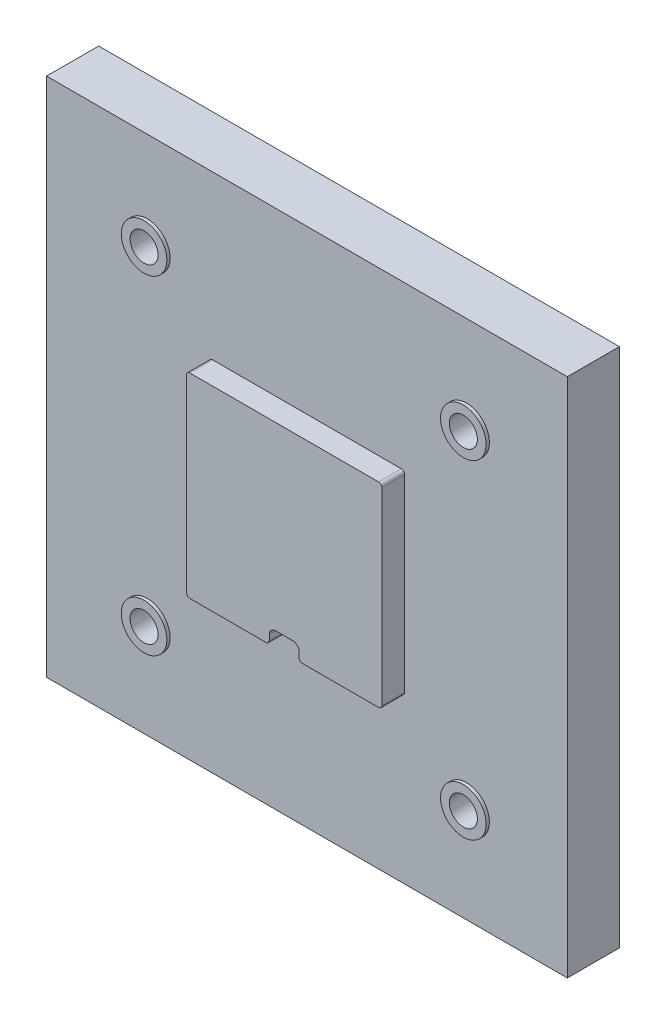
ISO-10303-21;
HEADER;
FILE_DESCRIPTION(('STEP AP214'),'2;1');
FILE_NAME('part.step','',(''),(''),'','','');
FILE_SCHEMA(('AUTOMOTIVE_DESIGN { 1 0 10303 214 1 1 1 1 }'));
ENDSEC;
DATA;
#1=APPLICATION_CONTEXT('core data for automotive mechanical design processes');
#2=APPLICATION_PROTOCOL_DEFINITION('international standard','automotive_design',2000,#1);
#3=PRODUCT_CONTEXT('',#1,'mechanical');
#4=PRODUCT('Part','Part','',(#3));
#5=PRODUCT_RELATED_PRODUCT_CATEGORY('part','',(#4));
#6=PRODUCT_DEFINITION_FORMATION('','',#4);
#7=PRODUCT_DEFINITION_CONTEXT('part definition',#1,'design');
#8=PRODUCT_DEFINITION('design','',#6,#7);
#9=PRODUCT_DEFINITION_SHAPE('','',#8);
#10=(LENGTH_UNIT() NAMED_UNIT(*) SI_UNIT(.MILLI.,.METRE.));
#11=(NAMED_UNIT(*) PLANE_ANGLE_UNIT() SI_UNIT($,.RADIAN.));
#12=(NAMED_UNIT(*) SI_UNIT($,.STERADIAN.) SOLID_ANGLE_UNIT());
#13=UNCERTAINTY_MEASURE_WITH_UNIT(LENGTH_MEASURE(1.E-05),#10,'distance_accuracy_value','');
#14=(GEOMETRIC_REPRESENTATION_CONTEXT(3) GLOBAL_UNCERTAINTY_ASSIGNED_CONTEXT((#13)) GLOBAL_UNIT_ASSIGNED_CONTEXT((#10,
#11,#12)) REPRESENTATION_CONTEXT('',''));
#15=CARTESIAN_POINT('',(0.,0.,0.));
#16=DIRECTION('',(0.,0.,1.));
#17=DIRECTION('',(1.,0.,0.));
#18=AXIS2_PLACEMENT_3D('',#15,#16,#17);
#19=CARTESIAN_POINT('',(15.,-15.,3.5));
#20=DIRECTION('',(0.,1.,0.));
#21=DIRECTION('',(-1.,0.,0.));
#22=AXIS2_PLACEMENT_3D('',#19,#20,#21);
#23=PLANE('',#22);
#24=DIRECTION('',(1.,0.,0.));
#25=VECTOR('',#24,1.);
#26=CARTESIAN_POINT('',(15.,-15.,0.));
#27=LINE('',#26,#25);
#28=CARTESIAN_POINT('',(2.79289321881345,-15.,0.));
#29=VERTEX_POINT('',#28);
#30=CARTESIAN_POINT('',(14.5,-15.,0.));
#31=VERTEX_POINT('',#30);
#32=EDGE_CURVE('E272',#29,#31,#27,.T.);
#33=ORIENTED_EDGE('',*,*,#32,.T.);
#34=DIRECTION('',(0.,0.,-1.));
#35=VECTOR('',#34,1.);
#36=CARTESIAN_POINT('',(14.5,-15.,3.5));
#37=LINE('',#36,#35);
#38=CARTESIAN_POINT('',(14.5,-15.,3.5));
#39=VERTEX_POINT('',#38);
#40=EDGE_CURVE('E314',#31,#39,#37,.F.);
#41=ORIENTED_EDGE('',*,*,#40,.T.);
#42=DIRECTION('',(1.,0.,0.));
#43=VECTOR('',#42,1.);
#44=CARTESIAN_POINT('',(15.,-15.,3.5));
#45=LINE('',#44,#43);
#46=CARTESIAN_POINT('',(2.79289321881345,-15.,3.5));
#47=VERTEX_POINT('',#46);
#48=EDGE_CURVE('E260',#47,#39,#45,.T.);
#49=ORIENTED_EDGE('',*,*,#48,.F.);
#50=DIRECTION('',(0.,0.,1.));
#51=VECTOR('',#50,1.);
#52=CARTESIAN_POINT('',(2.79289321881345,-15.,3.5));
#53=LINE('',#52,#51);
#54=EDGE_CURVE('E312',#47,#29,#53,.F.);
#55=ORIENTED_EDGE('',*,*,#54,.T.);
#56=EDGE_LOOP('',(#33,#41,#49,#55));
#57=FACE_BOUND('',#56,.T.);
#58=ADVANCED_FACE('F39',(#57),#23,.F.);
#59=CARTESIAN_POINT('',(-15.,-15.,3.5));
#60=DIRECTION('',(1.,0.,0.));
#61=DIRECTION('',(0.,1.,0.));
#62=AXIS2_PLACEMENT_3D('',#59,#60,#61);
#63=PLANE('',#62);
#64=DIRECTION('',(0.,-1.,0.));
#65=VECTOR('',#64,1.);
#66=CARTESIAN_POINT('',(-15.,-15.,3.5));
#67=LINE('',#66,#65);
#68=CARTESIAN_POINT('',(-15.,14.5,3.5));
#69=VERTEX_POINT('',#68);
#70=CARTESIAN_POINT('',(-15.,-14.5,3.5));
#71=VERTEX_POINT('',#70);
#72=EDGE_CURVE('E257',#69,#71,#67,.T.);
#73=ORIENTED_EDGE('',*,*,#72,.F.);
#74=DIRECTION('',(0.,0.,-1.));
#75=VECTOR('',#74,1.);
#76=CARTESIAN_POINT('',(-15.,14.5,3.5));
#77=LINE('',#76,#75);
#78=CARTESIAN_POINT('',(-15.,14.5,0.));
#79=VERTEX_POINT('',#78);
#80=EDGE_CURVE('E282',#69,#79,#77,.T.);
#81=ORIENTED_EDGE('',*,*,#80,.T.);
#82=DIRECTION('',(0.,-1.,0.));
#83=VECTOR('',#82,1.);
#84=CARTESIAN_POINT('',(-15.,-15.,0.));
#85=LINE('',#84,#83);
#86=CARTESIAN_POINT('',(-15.,-14.5,0.));
#87=VERTEX_POINT('',#86);
#88=EDGE_CURVE('E256',#79,#87,#85,.T.);
#89=ORIENTED_EDGE('',*,*,#88,.T.);
#90=DIRECTION('',(0.,0.,-1.));
#91=VECTOR('',#90,1.);
#92=CARTESIAN_POINT('',(-15.,-14.5,3.5));
#93=LINE('',#92,#91);
#94=EDGE_CURVE('E269',#87,#71,#93,.F.);
#95=ORIENTED_EDGE('',*,*,#94,.T.);
#96=EDGE_LOOP('',(#73,#81,#89,#95));
#97=FACE_BOUND('',#96,.T.);
#98=ADVANCED_FACE('F383',(#97),#63,.F.);
#99=CARTESIAN_POINT('',(-14.5,-15.,3.5));
#100=VERTEX_POINT('',#99);
#101=CARTESIAN_POINT('',(-2.79289321881346,-15.,3.5));
#102=VERTEX_POINT('',#101);
#103=EDGE_CURVE('E262',#100,#102,#45,.T.);
#104=ORIENTED_EDGE('',*,*,#103,.F.);
#105=DIRECTION('',(0.,0.,-1.));
#106=VECTOR('',#105,1.);
#107=CARTESIAN_POINT('',(-14.5,-15.,3.5));
#108=LINE('',#107,#106);
#109=CARTESIAN_POINT('',(-14.5,-15.,0.));
#110=VERTEX_POINT('',#109);
#111=EDGE_CURVE('E304',#100,#110,#108,.T.);
#112=ORIENTED_EDGE('',*,*,#111,.T.);
#113=CARTESIAN_POINT('',(-2.79289321881346,-15.,0.));
#114=VERTEX_POINT('',#113);
#115=EDGE_CURVE('E275',#110,#114,#27,.T.);
#116=ORIENTED_EDGE('',*,*,#115,.T.);
#117=DIRECTION('',(0.,0.,1.));
#118=VECTOR('',#117,1.);
#119=CARTESIAN_POINT('',(-2.79289321881346,-15.,3.5));
#120=LINE('',#119,#118);
#121=EDGE_CURVE('E301',#114,#102,#120,.T.);
#122=ORIENTED_EDGE('',*,*,#121,.T.);
#123=EDGE_LOOP('',(#104,#112,#116,#122));
#124=FACE_BOUND('',#123,.T.);
#125=ADVANCED_FACE('F386',(#124),#23,.F.);
#126=CARTESIAN_POINT('',(15.,15.,3.5));
#127=DIRECTION('',(-1.,0.,0.));
#128=DIRECTION('',(0.,-1.,0.));
#129=AXIS2_PLACEMENT_3D('',#126,#127,#128);
#130=PLANE('',#129);
#131=DIRECTION('',(0.,1.,0.));
#132=VECTOR('',#131,1.);
#133=CARTESIAN_POINT('',(15.,15.,0.));
#134=LINE('',#133,#132);
#135=CARTESIAN_POINT('',(15.,-14.5,0.));
#136=VERTEX_POINT('',#135);
#137=CARTESIAN_POINT('',(15.,14.5,0.));
#138=VERTEX_POINT('',#137);
#139=EDGE_CURVE('E276',#136,#138,#134,.T.);
#140=ORIENTED_EDGE('',*,*,#139,.T.);
#141=DIRECTION('',(0.,0.,-1.));
#142=VECTOR('',#141,1.);
#143=CARTESIAN_POINT('',(15.,14.5,3.5));
#144=LINE('',#143,#142);
#145=CARTESIAN_POINT('',(15.,14.5,3.5));
#146=VERTEX_POINT('',#145);
#147=EDGE_CURVE('E310',#138,#146,#144,.F.);
#148=ORIENTED_EDGE('',*,*,#147,.T.);
#149=DIRECTION('',(0.,1.,0.));
#150=VECTOR('',#149,1.);
#151=CARTESIAN_POINT('',(15.,15.,3.5));
#152=LINE('',#151,#150);
#153=CARTESIAN_POINT('',(15.,-14.5,3.5));
#154=VERTEX_POINT('',#153);
#155=EDGE_CURVE('E264',#154,#146,#152,.T.);
#156=ORIENTED_EDGE('',*,*,#155,.F.);
#157=DIRECTION('',(0.,0.,-1.));
#158=VECTOR('',#157,1.);
#159=CARTESIAN_POINT('',(15.,-14.5,3.5));
#160=LINE('',#159,#158);
#161=EDGE_CURVE('E307',#154,#136,#160,.T.);
#162=ORIENTED_EDGE('',*,*,#161,.T.);
#163=EDGE_LOOP('',(#140,#148,#156,#162));
#164=FACE_BOUND('',#163,.T.);
#165=ADVANCED_FACE('F394',(#164),#130,.F.);
#166=CARTESIAN_POINT('',(-15.,15.,3.5));
#167=DIRECTION('',(0.,-1.,0.));
#168=DIRECTION('',(1.,0.,0.));
#169=AXIS2_PLACEMENT_3D('',#166,#167,#168);
#170=PLANE('',#169);
#171=DIRECTION('',(-1.,0.,0.));
#172=VECTOR('',#171,1.);
#173=CARTESIAN_POINT('',(-15.,15.,0.));
#174=LINE('',#173,#172);
#175=CARTESIAN_POINT('',(14.5,15.,0.));
#176=VERTEX_POINT('',#175);
#177=CARTESIAN_POINT('',(-14.5,15.,0.));
#178=VERTEX_POINT('',#177);
#179=EDGE_CURVE('E261',#176,#178,#174,.T.);
#180=ORIENTED_EDGE('',*,*,#179,.T.);
#181=DIRECTION('',(0.,0.,-1.));
#182=VECTOR('',#181,1.);
#183=CARTESIAN_POINT('',(-14.5,15.,3.5));
#184=LINE('',#183,#182);
#185=CARTESIAN_POINT('',(-14.5,15.,3.5));
#186=VERTEX_POINT('',#185);
#187=EDGE_CURVE('E288',#178,#186,#184,.F.);
#188=ORIENTED_EDGE('',*,*,#187,.T.);
#189=DIRECTION('',(-1.,0.,0.));
#190=VECTOR('',#189,1.);
#191=CARTESIAN_POINT('',(-15.,15.,3.5));
#192=LINE('',#191,#190);
#193=CARTESIAN_POINT('',(14.5,15.,3.5));
#194=VERTEX_POINT('',#193);
#195=EDGE_CURVE('E267',#194,#186,#192,.T.);
#196=ORIENTED_EDGE('',*,*,#195,.F.);
#197=DIRECTION('',(0.,0.,-1.));
#198=VECTOR('',#197,1.);
#199=CARTESIAN_POINT('',(14.5,15.,3.5));
#200=LINE('',#199,#198);
#201=EDGE_CURVE('E285',#194,#176,#200,.T.);
#202=ORIENTED_EDGE('',*,*,#201,.T.);
#203=EDGE_LOOP('',(#180,#188,#196,#202));
#204=FACE_BOUND('',#203,.T.);
#205=ADVANCED_FACE('F399',(#204),#170,.F.);
#206=CARTESIAN_POINT('',(0.,0.,3.5));
#207=DIRECTION('',(0.,0.,-1.));
#208=DIRECTION('',(-1.,0.,0.));
#209=AXIS2_PLACEMENT_3D('',#206,#207,#208);
#210=PLANE('',#209);
#211=ORIENTED_EDGE('',*,*,#195,.T.);
#212=CARTESIAN_POINT('',(-14.5,14.5,3.5));
#213=DIRECTION('',(0.,0.,-1.));
#214=DIRECTION('',(-1.,0.,0.));
#215=AXIS2_PLACEMENT_3D('',#212,#213,#214);
#216=CIRCLE('',#215,0.5);
#217=EDGE_CURVE('E299',#186,#69,#216,.F.);
#218=ORIENTED_EDGE('',*,*,#217,.T.);
#219=ORIENTED_EDGE('',*,*,#72,.T.);
#220=CARTESIAN_POINT('',(-14.5,-14.5,3.5));
#221=DIRECTION('',(0.,0.,-1.));
#222=DIRECTION('',(-1.,0.,0.));
#223=AXIS2_PLACEMENT_3D('',#220,#221,#222);
#224=CIRCLE('',#223,0.5);
#225=EDGE_CURVE('E297',#71,#100,#224,.F.);
#226=ORIENTED_EDGE('',*,*,#225,.T.);
#227=ORIENTED_EDGE('',*,*,#103,.T.);
#228=CARTESIAN_POINT('',(-2.79289321881346,-14.5,3.5));
#229=DIRECTION('',(0.,0.,-1.));
#230=DIRECTION('',(-1.,0.,0.));
#231=AXIS2_PLACEMENT_3D('',#228,#229,#230);
#232=CIRCLE('',#231,0.5);
#233=CARTESIAN_POINT('',(-2.29289321881346,-14.5,3.5));
#234=VERTEX_POINT('',#233);
#235=EDGE_CURVE('E200',#102,#234,#232,.F.);
#236=ORIENTED_EDGE('',*,*,#235,.T.);
#237=DIRECTION('',(0.,-1.,0.));
#238=VECTOR('',#237,1.);
#239=CARTESIAN_POINT('',(-2.29289321881346,-13.7071067811865,3.5));
#240=LINE('',#239,#238);
#241=CARTESIAN_POINT('',(-2.29289321881346,-13.7071067811865,3.5));
#242=VERTEX_POINT('',#241);
#243=EDGE_CURVE('E180',#242,#234,#240,.T.);
#244=ORIENTED_EDGE('',*,*,#243,.F.);
#245=CARTESIAN_POINT('',(-1.29289321881346,-13.7071067811865,3.5));
#246=DIRECTION('',(0.,0.,1.));
#247=DIRECTION('',(1.,0.,0.));
#248=AXIS2_PLACEMENT_3D('',#245,#246,#247);
#249=CIRCLE('',#248,1.);
#250=CARTESIAN_POINT('',(-1.29289321881346,-12.7071067811865,3.5));
#251=VERTEX_POINT('',#250);
#252=EDGE_CURVE('E187',#251,#242,#249,.T.);
#253=ORIENTED_EDGE('',*,*,#252,.F.);
#254=DIRECTION('',(-1.,0.,0.));
#255=VECTOR('',#254,1.);
#256=CARTESIAN_POINT('',(1.29289321881345,-12.7071067811865,3.5));
#257=LINE('',#256,#255);
#258=CARTESIAN_POINT('',(1.29289321881345,-12.7071067811865,3.5));
#259=VERTEX_POINT('',#258);
#260=EDGE_CURVE('E195',#259,#251,#257,.T.);
#261=ORIENTED_EDGE('',*,*,#260,.F.);
#262=CARTESIAN_POINT('',(1.29289321881345,-13.7071067811865,3.5));
#263=DIRECTION('',(0.,0.,1.));
#264=DIRECTION('',(1.,0.,0.));
#265=AXIS2_PLACEMENT_3D('',#262,#263,#264);
#266=CIRCLE('',#265,1.);
#267=CARTESIAN_POINT('',(2.29289321881345,-13.7071067811865,3.5));
#268=VERTEX_POINT('',#267);
#269=EDGE_CURVE('E204',#268,#259,#266,.T.);
#270=ORIENTED_EDGE('',*,*,#269,.F.);
#271=DIRECTION('',(0.,1.,0.));
#272=VECTOR('',#271,1.);
#273=CARTESIAN_POINT('',(2.29289321881345,-15.,3.5));
#274=LINE('',#273,#272);
#275=CARTESIAN_POINT('',(2.29289321881345,-14.5,3.5));
#276=VERTEX_POINT('',#275);
#277=EDGE_CURVE('E201',#276,#268,#274,.T.);
#278=ORIENTED_EDGE('',*,*,#277,.F.);
#279=CARTESIAN_POINT('',(2.79289321881345,-14.5,3.5));
#280=DIRECTION('',(0.,0.,-1.));
#281=DIRECTION('',(-1.,0.,0.));
#282=AXIS2_PLACEMENT_3D('',#279,#280,#281);
#283=CIRCLE('',#282,0.5);
#284=EDGE_CURVE('E291',#276,#47,#283,.F.);
#285=ORIENTED_EDGE('',*,*,#284,.T.);
#286=ORIENTED_EDGE('',*,*,#48,.T.);
#287=CARTESIAN_POINT('',(14.5,-14.5,3.5));
#288=DIRECTION('',(0.,0.,-1.));
#289=DIRECTION('',(-1.,0.,0.));
#290=AXIS2_PLACEMENT_3D('',#287,#288,#289);
#291=CIRCLE('',#290,0.5);
#292=EDGE_CURVE('E293',#39,#154,#291,.F.);
#293=ORIENTED_EDGE('',*,*,#292,.T.);
#294=ORIENTED_EDGE('',*,*,#155,.T.);
#295=CARTESIAN_POINT('',(14.5,14.5,3.5));
#296=DIRECTION('',(0.,0.,-1.));
#297=DIRECTION('',(-1.,0.,0.));
#298=AXIS2_PLACEMENT_3D('',#295,#296,#297);
#299=CIRCLE('',#298,0.5);
#300=EDGE_CURVE('E295',#146,#194,#299,.F.);
#301=ORIENTED_EDGE('',*,*,#300,.T.);
#302=EDGE_LOOP('',(#211,#218,#219,#226,#227,#236,#244,#253,#261,#270,#278,#285,#286,#293,#294,#301));
#303=FACE_BOUND('',#302,.T.);
#304=ADVANCED_FACE('F198',(#303),#210,.F.);
#305=CARTESIAN_POINT('',(-40.,-40.,-8.));
#306=DIRECTION('',(1.,0.,0.));
#307=DIRECTION('',(0.,1.,0.));
#308=AXIS2_PLACEMENT_3D('',#305,#306,#307);
#309=PLANE('',#308);
#310=DIRECTION('',(0.,1.,0.));
#311=VECTOR('',#310,1.);
#312=CARTESIAN_POINT('',(-40.,-40.,0.));
#313=LINE('',#312,#311);
#314=CARTESIAN_POINT('',(-40.,-40.,0.));
#315=VERTEX_POINT('',#314);
#316=CARTESIAN_POINT('',(-40.,40.,0.));
#317=VERTEX_POINT('',#316);
#318=EDGE_CURVE('E212',#315,#317,#313,.T.);
#319=ORIENTED_EDGE('',*,*,#318,.T.);
#320=DIRECTION('',(0.,0.,1.));
#321=VECTOR('',#320,1.);
#322=CARTESIAN_POINT('',(-40.,40.,-8.));
#323=LINE('',#322,#321);
#324=CARTESIAN_POINT('',(-40.,40.,-8.));
#325=VERTEX_POINT('',#324);
#326=EDGE_CURVE('E253',#325,#317,#323,.T.);
#327=ORIENTED_EDGE('',*,*,#326,.F.);
#328=DIRECTION('',(0.,1.,0.));
#329=VECTOR('',#328,1.);
#330=CARTESIAN_POINT('',(-40.,-40.,-8.));
#331=LINE('',#330,#329);
#332=CARTESIAN_POINT('',(-40.,-40.,-8.));
#333=VERTEX_POINT('',#332);
#334=EDGE_CURVE('E227',#333,#325,#331,.T.);
#335=ORIENTED_EDGE('',*,*,#334,.F.);
#336=DIRECTION('',(0.,0.,1.));
#337=VECTOR('',#336,1.);
#338=CARTESIAN_POINT('',(-40.,-40.,-8.));
#339=LINE('',#338,#337);
#340=EDGE_CURVE('E237',#333,#315,#339,.T.);
#341=ORIENTED_EDGE('',*,*,#340,.T.);
#342=EDGE_LOOP('',(#319,#327,#335,#341));
#343=FACE_BOUND('',#342,.T.);
#344=ADVANCED_FACE('F358',(#343),#309,.F.);
#345=CARTESIAN_POINT('',(-40.,40.,-8.));
#346=DIRECTION('',(0.,-1.,0.));
#347=DIRECTION('',(0.,0.,-1.));
#348=AXIS2_PLACEMENT_3D('',#345,#346,#347);
#349=PLANE('',#348);
#350=DIRECTION('',(1.,0.,0.));
#351=VECTOR('',#350,1.);
#352=CARTESIAN_POINT('',(-40.,40.,0.));
#353=LINE('',#352,#351);
#354=CARTESIAN_POINT('',(40.,40.,0.));
#355=VERTEX_POINT('',#354);
#356=EDGE_CURVE('E240',#317,#355,#353,.T.);
#357=ORIENTED_EDGE('',*,*,#356,.T.);
#358=DIRECTION('',(0.,0.,1.));
#359=VECTOR('',#358,1.);
#360=CARTESIAN_POINT('',(40.,40.,-8.));
#361=LINE('',#360,#359);
#362=CARTESIAN_POINT('',(40.,40.,-8.));
#363=VERTEX_POINT('',#362);
#364=EDGE_CURVE('E250',#363,#355,#361,.T.);
#365=ORIENTED_EDGE('',*,*,#364,.F.);
#366=DIRECTION('',(1.,0.,0.));
#367=VECTOR('',#366,1.);
#368=CARTESIAN_POINT('',(-40.,40.,-8.));
#369=LINE('',#368,#367);
#370=EDGE_CURVE('E230',#325,#363,#369,.T.);
#371=ORIENTED_EDGE('',*,*,#370,.F.);
#372=ORIENTED_EDGE('',*,*,#326,.T.);
#373=EDGE_LOOP('',(#357,#365,#371,#372));
#374=FACE_BOUND('',#373,.T.);
#375=ADVANCED_FACE('F370',(#374),#349,.F.);
#376=CARTESIAN_POINT('',(40.,40.,-8.));
#377=DIRECTION('',(-1.,0.,0.));
#378=DIRECTION('',(0.,-1.,0.));
#379=AXIS2_PLACEMENT_3D('',#376,#377,#378);
#380=PLANE('',#379);
#381=DIRECTION('',(0.,-1.,0.));
#382=VECTOR('',#381,1.);
#383=CARTESIAN_POINT('',(40.,40.,0.));
#384=LINE('',#383,#382);
#385=CARTESIAN_POINT('',(40.,-40.,0.));
#386=VERTEX_POINT('',#385);
#387=EDGE_CURVE('E242',#355,#386,#384,.T.);
#388=ORIENTED_EDGE('',*,*,#387,.T.);
#389=DIRECTION('',(0.,0.,1.));
#390=VECTOR('',#389,1.);
#391=CARTESIAN_POINT('',(40.,-40.,-8.));
#392=LINE('',#391,#390);
#393=CARTESIAN_POINT('',(40.,-40.,-8.));
#394=VERTEX_POINT('',#393);
#395=EDGE_CURVE('E247',#394,#386,#392,.T.);
#396=ORIENTED_EDGE('',*,*,#395,.F.);
#397=DIRECTION('',(0.,-1.,0.));
#398=VECTOR('',#397,1.);
#399=CARTESIAN_POINT('',(40.,40.,-8.));
#400=LINE('',#399,#398);
#401=EDGE_CURVE('E233',#363,#394,#400,.T.);
#402=ORIENTED_EDGE('',*,*,#401,.F.);
#403=ORIENTED_EDGE('',*,*,#364,.T.);
#404=EDGE_LOOP('',(#388,#396,#402,#403));
#405=FACE_BOUND('',#404,.T.);
#406=ADVANCED_FACE('F367',(#405),#380,.F.);
#407=CARTESIAN_POINT('',(40.,-40.,-8.));
#408=DIRECTION('',(0.,1.,0.));
#409=DIRECTION('',(0.,0.,1.));
#410=AXIS2_PLACEMENT_3D('',#407,#408,#409);
#411=PLANE('',#410);
#412=DIRECTION('',(-1.,0.,0.));
#413=VECTOR('',#412,1.);
#414=CARTESIAN_POINT('',(40.,-40.,0.));
#415=LINE('',#414,#413);
#416=EDGE_CURVE('E231',#386,#315,#415,.T.);
#417=ORIENTED_EDGE('',*,*,#416,.T.);
#418=ORIENTED_EDGE('',*,*,#340,.F.);
#419=DIRECTION('',(-1.,0.,0.));
#420=VECTOR('',#419,1.);
#421=CARTESIAN_POINT('',(40.,-40.,-8.));
#422=LINE('',#421,#420);
#423=EDGE_CURVE('E235',#394,#333,#422,.T.);
#424=ORIENTED_EDGE('',*,*,#423,.F.);
#425=ORIENTED_EDGE('',*,*,#395,.T.);
#426=EDGE_LOOP('',(#417,#418,#424,#425));
#427=FACE_BOUND('',#426,.T.);
#428=ADVANCED_FACE('F363',(#427),#411,.F.);
#429=CARTESIAN_POINT('',(0.,0.,-8.));
#430=DIRECTION('',(0.,0.,-1.));
#431=DIRECTION('',(-1.,0.,0.));
#432=AXIS2_PLACEMENT_3D('',#429,#430,#431);
#433=PLANE('',#432);
#434=CARTESIAN_POINT('',(-24.525,-25.25,-8.));
#435=DIRECTION('',(0.,0.,-1.));
#436=DIRECTION('',(-1.,0.,0.));
#437=AXIS2_PLACEMENT_3D('',#434,#435,#436);
#438=CIRCLE('',#437,3.5725);
#439=CARTESIAN_POINT('',(-28.0975,-25.25,-8.));
#440=VERTEX_POINT('',#439);
#441=EDGE_CURVE('E475',#440,#440,#438,.T.);
#442=ORIENTED_EDGE('',*,*,#441,.F.);
#443=EDGE_LOOP('',(#442));
#444=FACE_BOUND('',#443,.T.);
#445=CARTESIAN_POINT('',(-24.525,25.25,-8.));
#446=DIRECTION('',(0.,0.,-1.));
#447=DIRECTION('',(-1.,0.,0.));
#448=AXIS2_PLACEMENT_3D('',#445,#446,#447);
#449=CIRCLE('',#448,3.5725);
#450=CARTESIAN_POINT('',(-28.0975,25.25,-8.));
#451=VERTEX_POINT('',#450);
#452=EDGE_CURVE('E466',#451,#451,#449,.T.);
#453=ORIENTED_EDGE('',*,*,#452,.F.);
#454=EDGE_LOOP('',(#453));
#455=FACE_BOUND('',#454,.T.);
#456=CARTESIAN_POINT('',(24.525,25.25,-8.));
#457=DIRECTION('',(0.,0.,-1.));
#458=DIRECTION('',(-1.,0.,0.));
#459=AXIS2_PLACEMENT_3D('',#456,#457,#458);
#460=CIRCLE('',#459,3.5725);
#461=CARTESIAN_POINT('',(20.9525,25.25,-8.));
#462=VERTEX_POINT('',#461);
#463=EDGE_CURVE('E457',#462,#462,#460,.T.);
#464=ORIENTED_EDGE('',*,*,#463,.F.);
#465=EDGE_LOOP('',(#464));
#466=FACE_BOUND('',#465,.T.);
#467=CARTESIAN_POINT('',(24.525,-25.25,-8.));
#468=DIRECTION('',(0.,0.,-1.));
#469=DIRECTION('',(-1.,0.,0.));
#470=AXIS2_PLACEMENT_3D('',#467,#468,#469);
#471=CIRCLE('',#470,3.5725);
#472=CARTESIAN_POINT('',(20.9525,-25.25,-8.));
#473=VERTEX_POINT('',#472);
#474=EDGE_CURVE('E448',#473,#473,#471,.T.);
#475=ORIENTED_EDGE('',*,*,#474,.F.);
#476=EDGE_LOOP('',(#475));
#477=FACE_BOUND('',#476,.T.);
#478=ORIENTED_EDGE('',*,*,#334,.T.);
#479=ORIENTED_EDGE('',*,*,#370,.T.);
#480=ORIENTED_EDGE('',*,*,#401,.T.);
#481=ORIENTED_EDGE('',*,*,#423,.T.);
#482=EDGE_LOOP('',(#478,#479,#480,#481));
#483=FACE_BOUND('',#482,.T.);
#484=ADVANCED_FACE('F345',(#444,#455,#466,#477,#483),#433,.T.);
#485=CARTESIAN_POINT('',(0.,0.,0.));
#486=DIRECTION('',(0.,0.,-1.));
#487=DIRECTION('',(-1.,0.,0.));
#488=AXIS2_PLACEMENT_3D('',#485,#486,#487);
#489=PLANE('',#488);
#490=CARTESIAN_POINT('',(24.525,-25.25,0.));
#491=DIRECTION('',(0.,0.,-1.));
#492=DIRECTION('',(-1.,0.,0.));
#493=AXIS2_PLACEMENT_3D('',#490,#491,#492);
#494=CIRCLE('',#493,3.5);
#495=CARTESIAN_POINT('',(21.025,-25.25,0.));
#496=VERTEX_POINT('',#495);
#497=EDGE_CURVE('E11',#496,#496,#494,.F.);
#498=ORIENTED_EDGE('',*,*,#497,.F.);
#499=EDGE_LOOP('',(#498));
#500=FACE_BOUND('',#499,.T.);
#501=CARTESIAN_POINT('',(-24.525,-25.25,0.));
#502=DIRECTION('',(0.,0.,-1.));
#503=DIRECTION('',(-1.,0.,0.));
#504=AXIS2_PLACEMENT_3D('',#501,#502,#503);
#505=CIRCLE('',#504,3.5);
#506=CARTESIAN_POINT('',(-28.025,-25.25,0.));
#507=VERTEX_POINT('',#506);
#508=EDGE_CURVE('E47',#507,#507,#505,.F.);
#509=ORIENTED_EDGE('',*,*,#508,.F.);
#510=EDGE_LOOP('',(#509));
#511=FACE_BOUND('',#510,.T.);
#512=CARTESIAN_POINT('',(24.525,25.25,0.));
#513=DIRECTION('',(0.,0.,-1.));
#514=DIRECTION('',(-1.,0.,0.));
#515=AXIS2_PLACEMENT_3D('',#512,#513,#514);
#516=CIRCLE('',#515,3.5);
#517=CARTESIAN_POINT('',(21.025,25.25,0.));
#518=VERTEX_POINT('',#517);
#519=EDGE_CURVE('E334',#518,#518,#516,.F.);
#520=ORIENTED_EDGE('',*,*,#519,.F.);
#521=EDGE_LOOP('',(#520));
#522=FACE_BOUND('',#521,.T.);
#523=CARTESIAN_POINT('',(-24.525,25.25,0.));
#524=DIRECTION('',(0.,0.,-1.));
#525=DIRECTION('',(-1.,0.,0.));
#526=AXIS2_PLACEMENT_3D('',#523,#524,#525);
#527=CIRCLE('',#526,3.5);
#528=CARTESIAN_POINT('',(-28.025,25.25,0.));
#529=VERTEX_POINT('',#528);
#530=EDGE_CURVE('E331',#529,#529,#527,.F.);
#531=ORIENTED_EDGE('',*,*,#530,.F.);
#532=EDGE_LOOP('',(#531));
#533=FACE_BOUND('',#532,.T.);
#534=ORIENTED_EDGE('',*,*,#88,.F.);
#535=CARTESIAN_POINT('',(-14.5,14.5,0.));
#536=DIRECTION('',(0.,0.,-1.));
#537=DIRECTION('',(-1.,0.,0.));
#538=AXIS2_PLACEMENT_3D('',#535,#536,#537);
#539=CIRCLE('',#538,0.5);
#540=EDGE_CURVE('E320',#79,#178,#539,.T.);
#541=ORIENTED_EDGE('',*,*,#540,.T.);
#542=ORIENTED_EDGE('',*,*,#179,.F.);
#543=CARTESIAN_POINT('',(14.5,14.5,0.));
#544=DIRECTION('',(0.,0.,-1.));
#545=DIRECTION('',(-1.,0.,0.));
#546=AXIS2_PLACEMENT_3D('',#543,#544,#545);
#547=CIRCLE('',#546,0.5);
#548=EDGE_CURVE('E324',#176,#138,#547,.T.);
#549=ORIENTED_EDGE('',*,*,#548,.T.);
#550=ORIENTED_EDGE('',*,*,#139,.F.);
#551=CARTESIAN_POINT('',(14.5,-14.5,0.));
#552=DIRECTION('',(0.,0.,-1.));
#553=DIRECTION('',(-1.,0.,0.));
#554=AXIS2_PLACEMENT_3D('',#551,#552,#553);
#555=CIRCLE('',#554,0.5);
#556=EDGE_CURVE('E326',#136,#31,#555,.T.);
#557=ORIENTED_EDGE('',*,*,#556,.T.);
#558=ORIENTED_EDGE('',*,*,#32,.F.);
#559=CARTESIAN_POINT('',(2.79289321881345,-14.5,0.));
#560=DIRECTION('',(0.,0.,-1.));
#561=DIRECTION('',(-1.,0.,0.));
#562=AXIS2_PLACEMENT_3D('',#559,#560,#561);
#563=CIRCLE('',#562,0.5);
#564=CARTESIAN_POINT('',(2.29289321881345,-14.5,0.));
#565=VERTEX_POINT('',#564);
#566=EDGE_CURVE('E62',#29,#565,#563,.T.);
#567=ORIENTED_EDGE('',*,*,#566,.T.);
#568=DIRECTION('',(0.,1.,0.));
#569=VECTOR('',#568,1.);
#570=CARTESIAN_POINT('',(2.29289321881345,-15.,0.));
#571=LINE('',#570,#569);
#572=CARTESIAN_POINT('',(2.29289321881345,-13.7071067811865,0.));
#573=VERTEX_POINT('',#572);
#574=EDGE_CURVE('E194',#565,#573,#571,.T.);
#575=ORIENTED_EDGE('',*,*,#574,.T.);
#576=CARTESIAN_POINT('',(1.29289321881345,-13.7071067811865,0.));
#577=DIRECTION('',(0.,0.,-1.));
#578=DIRECTION('',(-1.,0.,0.));
#579=AXIS2_PLACEMENT_3D('',#576,#577,#578);
#580=CIRCLE('',#579,1.);
#581=CARTESIAN_POINT('',(1.29289321881345,-12.7071067811865,0.));
#582=VERTEX_POINT('',#581);
#583=EDGE_CURVE('E218',#573,#582,#580,.F.);
#584=ORIENTED_EDGE('',*,*,#583,.T.);
#585=DIRECTION('',(-1.,0.,0.));
#586=VECTOR('',#585,1.);
#587=CARTESIAN_POINT('',(1.29289321881345,-12.7071067811865,0.));
#588=LINE('',#587,#586);
#589=CARTESIAN_POINT('',(-1.29289321881346,-12.7071067811865,0.));
#590=VERTEX_POINT('',#589);
#591=EDGE_CURVE('E214',#582,#590,#588,.T.);
#592=ORIENTED_EDGE('',*,*,#591,.T.);
#593=CARTESIAN_POINT('',(-1.29289321881346,-13.7071067811865,0.));
#594=DIRECTION('',(0.,0.,-1.));
#595=DIRECTION('',(-1.,0.,0.));
#596=AXIS2_PLACEMENT_3D('',#593,#594,#595);
#597=CIRCLE('',#596,1.);
#598=CARTESIAN_POINT('',(-2.29289321881346,-13.7071067811865,0.));
#599=VERTEX_POINT('',#598);
#600=EDGE_CURVE('E184',#590,#599,#597,.F.);
#601=ORIENTED_EDGE('',*,*,#600,.T.);
#602=DIRECTION('',(0.,-1.,0.));
#603=VECTOR('',#602,1.);
#604=CARTESIAN_POINT('',(-2.29289321881346,-13.7071067811865,0.));
#605=LINE('',#604,#603);
#606=CARTESIAN_POINT('',(-2.29289321881346,-14.5,0.));
#607=VERTEX_POINT('',#606);
#608=EDGE_CURVE('E181',#599,#607,#605,.T.);
#609=ORIENTED_EDGE('',*,*,#608,.T.);
#610=CARTESIAN_POINT('',(-2.79289321881346,-14.5,0.));
#611=DIRECTION('',(0.,0.,-1.));
#612=DIRECTION('',(-1.,0.,0.));
#613=AXIS2_PLACEMENT_3D('',#610,#611,#612);
#614=CIRCLE('',#613,0.5);
#615=EDGE_CURVE('E329',#607,#114,#614,.T.);
#616=ORIENTED_EDGE('',*,*,#615,.T.);
#617=ORIENTED_EDGE('',*,*,#115,.F.);
#618=CARTESIAN_POINT('',(-14.5,-14.5,0.));
#619=DIRECTION('',(0.,0.,-1.));
#620=DIRECTION('',(-1.,0.,0.));
#621=AXIS2_PLACEMENT_3D('',#618,#619,#620);
#622=CIRCLE('',#621,0.5);
#623=EDGE_CURVE('E322',#110,#87,#622,.T.);
#624=ORIENTED_EDGE('',*,*,#623,.T.);
#625=EDGE_LOOP('',(#534,#541,#542,#549,#550,#557,#558,#567,#575,#584,#592,#601,#609,#616,#617,#624));
#626=FACE_BOUND('',#625,.T.);
#627=ORIENTED_EDGE('',*,*,#318,.F.);
#628=ORIENTED_EDGE('',*,*,#416,.F.);
#629=ORIENTED_EDGE('',*,*,#387,.F.);
#630=ORIENTED_EDGE('',*,*,#356,.F.);
#631=EDGE_LOOP('',(#627,#628,#629,#630));
#632=FACE_BOUND('',#631,.T.);
#633=ADVANCED_FACE('F341',(#500,#511,#522,#533,#626,#632),#489,.F.);
#634=CARTESIAN_POINT('',(2.29289321881345,-15.,-5.12706510241518));
#635=DIRECTION('',(1.,0.,0.));
#636=DIRECTION('',(0.,0.,-1.));
#637=AXIS2_PLACEMENT_3D('',#634,#635,#636);
#638=PLANE('',#637);
#639=ORIENTED_EDGE('',*,*,#574,.F.);
#640=DIRECTION('',(0.,0.,1.));
#641=VECTOR('',#640,1.);
#642=CARTESIAN_POINT('',(2.29289321881345,-14.5,-5.12706510241518));
#643=LINE('',#642,#641);
#644=EDGE_CURVE('E316',#565,#276,#643,.T.);
#645=ORIENTED_EDGE('',*,*,#644,.T.);
#646=ORIENTED_EDGE('',*,*,#277,.T.);
#647=DIRECTION('',(0.,0.,1.));
#648=VECTOR('',#647,1.);
#649=CARTESIAN_POINT('',(2.29289321881345,-13.7071067811865,-5.12706510241518));
#650=LINE('',#649,#648);
#651=EDGE_CURVE('E221',#573,#268,#650,.T.);
#652=ORIENTED_EDGE('',*,*,#651,.F.);
#653=EDGE_LOOP('',(#639,#645,#646,#652));
#654=FACE_BOUND('',#653,.T.);
#655=ADVANCED_FACE('F344',(#654),#638,.F.);
#656=CARTESIAN_POINT('',(1.29289321881345,-13.7071067811865,-5.12706510241518));
#657=DIRECTION('',(0.,0.,1.));
#658=DIRECTION('',(1.,0.,0.));
#659=AXIS2_PLACEMENT_3D('',#656,#657,#658);
#660=CYLINDRICAL_SURFACE('',#659,1.);
#661=ORIENTED_EDGE('',*,*,#651,.T.);
#662=ORIENTED_EDGE('',*,*,#269,.T.);
#663=DIRECTION('',(0.,0.,1.));
#664=VECTOR('',#663,1.);
#665=CARTESIAN_POINT('',(1.29289321881345,-12.7071067811865,-5.12706510241518));
#666=LINE('',#665,#664);
#667=EDGE_CURVE('E217',#582,#259,#666,.T.);
#668=ORIENTED_EDGE('',*,*,#667,.F.);
#669=ORIENTED_EDGE('',*,*,#583,.F.);
#670=EDGE_LOOP('',(#661,#662,#668,#669));
#671=FACE_BOUND('',#670,.T.);
#672=ADVANCED_FACE('F596',(#671),#660,.F.);
#673=CARTESIAN_POINT('',(1.29289321881345,-12.7071067811865,-5.12706510241518));
#674=DIRECTION('',(0.,1.,0.));
#675=DIRECTION('',(0.,0.,1.));
#676=AXIS2_PLACEMENT_3D('',#673,#674,#675);
#677=PLANE('',#676);
#678=ORIENTED_EDGE('',*,*,#667,.T.);
#679=ORIENTED_EDGE('',*,*,#260,.T.);
#680=DIRECTION('',(0.,0.,1.));
#681=VECTOR('',#680,1.);
#682=CARTESIAN_POINT('',(-1.29289321881346,-12.7071067811865,-5.12706510241518));
#683=LINE('',#682,#681);
#684=EDGE_CURVE('E190',#590,#251,#683,.T.);
#685=ORIENTED_EDGE('',*,*,#684,.F.);
#686=ORIENTED_EDGE('',*,*,#591,.F.);
#687=EDGE_LOOP('',(#678,#679,#685,#686));
#688=FACE_BOUND('',#687,.T.);
#689=ADVANCED_FACE('F593',(#688),#677,.F.);
#690=CARTESIAN_POINT('',(-1.29289321881346,-13.7071067811865,-5.12706510241518));
#691=DIRECTION('',(0.,0.,1.));
#692=DIRECTION('',(1.,0.,0.));
#693=AXIS2_PLACEMENT_3D('',#690,#691,#692);
#694=CYLINDRICAL_SURFACE('',#693,1.);
#695=ORIENTED_EDGE('',*,*,#684,.T.);
#696=ORIENTED_EDGE('',*,*,#252,.T.);
#697=DIRECTION('',(0.,0.,1.));
#698=VECTOR('',#697,1.);
#699=CARTESIAN_POINT('',(-2.29289321881346,-13.7071067811865,-5.12706510241518));
#700=LINE('',#699,#698);
#701=EDGE_CURVE('E176',#599,#242,#700,.T.);
#702=ORIENTED_EDGE('',*,*,#701,.F.);
#703=ORIENTED_EDGE('',*,*,#600,.F.);
#704=EDGE_LOOP('',(#695,#696,#702,#703));
#705=FACE_BOUND('',#704,.T.);
#706=ADVANCED_FACE('F188',(#705),#694,.F.);
#707=CARTESIAN_POINT('',(-2.29289321881346,-13.7071067811865,-5.12706510241518));
#708=DIRECTION('',(-1.,0.,0.));
#709=DIRECTION('',(0.,0.,1.));
#710=AXIS2_PLACEMENT_3D('',#707,#708,#709);
#711=PLANE('',#710);
#712=ORIENTED_EDGE('',*,*,#243,.T.);
#713=DIRECTION('',(0.,0.,1.));
#714=VECTOR('',#713,1.);
#715=CARTESIAN_POINT('',(-2.29289321881346,-14.5,-5.12706510241518));
#716=LINE('',#715,#714);
#717=EDGE_CURVE('E54',#234,#607,#716,.F.);
#718=ORIENTED_EDGE('',*,*,#717,.T.);
#719=ORIENTED_EDGE('',*,*,#608,.F.);
#720=ORIENTED_EDGE('',*,*,#701,.T.);
#721=EDGE_LOOP('',(#712,#718,#719,#720));
#722=FACE_BOUND('',#721,.T.);
#723=ADVANCED_FACE('F178',(#722),#711,.F.);
#724=CARTESIAN_POINT('',(-14.5,14.5,3.5));
#725=DIRECTION('',(0.,0.,-1.));
#726=DIRECTION('',(-1.,0.,0.));
#727=AXIS2_PLACEMENT_3D('',#724,#725,#726);
#728=CYLINDRICAL_SURFACE('',#727,0.5);
#729=ORIENTED_EDGE('',*,*,#217,.F.);
#730=ORIENTED_EDGE('',*,*,#187,.F.);
#731=ORIENTED_EDGE('',*,*,#540,.F.);
#732=ORIENTED_EDGE('',*,*,#80,.F.);
#733=EDGE_LOOP('',(#729,#730,#731,#732));
#734=FACE_BOUND('',#733,.T.);
#735=ADVANCED_FACE('F414',(#734),#728,.T.);
#736=CARTESIAN_POINT('',(-14.5,-14.5,3.5));
#737=DIRECTION('',(0.,0.,-1.));
#738=DIRECTION('',(-1.,0.,0.));
#739=AXIS2_PLACEMENT_3D('',#736,#737,#738);
#740=CYLINDRICAL_SURFACE('',#739,0.5);
#741=ORIENTED_EDGE('',*,*,#225,.F.);
#742=ORIENTED_EDGE('',*,*,#94,.F.);
#743=ORIENTED_EDGE('',*,*,#623,.F.);
#744=ORIENTED_EDGE('',*,*,#111,.F.);
#745=EDGE_LOOP('',(#741,#742,#743,#744));
#746=FACE_BOUND('',#745,.T.);
#747=ADVANCED_FACE('F408',(#746),#740,.T.);
#748=CARTESIAN_POINT('',(14.5,14.5,3.5));
#749=DIRECTION('',(0.,0.,-1.));
#750=DIRECTION('',(-1.,0.,0.));
#751=AXIS2_PLACEMENT_3D('',#748,#749,#750);
#752=CYLINDRICAL_SURFACE('',#751,0.5);
#753=ORIENTED_EDGE('',*,*,#300,.F.);
#754=ORIENTED_EDGE('',*,*,#147,.F.);
#755=ORIENTED_EDGE('',*,*,#548,.F.);
#756=ORIENTED_EDGE('',*,*,#201,.F.);
#757=EDGE_LOOP('',(#753,#754,#755,#756));
#758=FACE_BOUND('',#757,.T.);
#759=ADVANCED_FACE('F422',(#758),#752,.T.);
#760=CARTESIAN_POINT('',(14.5,-14.5,3.5));
#761=DIRECTION('',(0.,0.,-1.));
#762=DIRECTION('',(-1.,0.,0.));
#763=AXIS2_PLACEMENT_3D('',#760,#761,#762);
#764=CYLINDRICAL_SURFACE('',#763,0.5);
#765=ORIENTED_EDGE('',*,*,#292,.F.);
#766=ORIENTED_EDGE('',*,*,#40,.F.);
#767=ORIENTED_EDGE('',*,*,#556,.F.);
#768=ORIENTED_EDGE('',*,*,#161,.F.);
#769=EDGE_LOOP('',(#765,#766,#767,#768));
#770=FACE_BOUND('',#769,.T.);
#771=ADVANCED_FACE('F429',(#770),#764,.T.);
#772=CARTESIAN_POINT('',(2.79289321881345,-14.5,-5.12706510241518));
#773=DIRECTION('',(0.,0.,1.));
#774=DIRECTION('',(1.,0.,0.));
#775=AXIS2_PLACEMENT_3D('',#772,#773,#774);
#776=CYLINDRICAL_SURFACE('',#775,0.5);
#777=ORIENTED_EDGE('',*,*,#566,.F.);
#778=ORIENTED_EDGE('',*,*,#54,.F.);
#779=ORIENTED_EDGE('',*,*,#284,.F.);
#780=ORIENTED_EDGE('',*,*,#644,.F.);
#781=EDGE_LOOP('',(#777,#778,#779,#780));
#782=FACE_BOUND('',#781,.T.);
#783=ADVANCED_FACE('F435',(#782),#776,.T.);
#784=CARTESIAN_POINT('',(-2.79289321881346,-14.5,3.5));
#785=DIRECTION('',(0.,0.,1.));
#786=DIRECTION('',(1.,0.,0.));
#787=AXIS2_PLACEMENT_3D('',#784,#785,#786);
#788=CYLINDRICAL_SURFACE('',#787,0.5);
#789=ORIENTED_EDGE('',*,*,#615,.F.);
#790=ORIENTED_EDGE('',*,*,#717,.F.);
#791=ORIENTED_EDGE('',*,*,#235,.F.);
#792=ORIENTED_EDGE('',*,*,#121,.F.);
#793=EDGE_LOOP('',(#789,#790,#791,#792));
#794=FACE_BOUND('',#793,.T.);
#795=ADVANCED_FACE('F41',(#794),#788,.T.);
#796=CARTESIAN_POINT('',(24.525,-25.25,-8.));
#797=DIRECTION('',(0.,0.,-1.));
#798=DIRECTION('',(-1.,0.,0.));
#799=AXIS2_PLACEMENT_3D('',#796,#797,#798);
#800=CYLINDRICAL_SURFACE('',#799,2.1525);
#801=CARTESIAN_POINT('',(24.525,-25.25,-3.99999999999999));
#802=DIRECTION('',(0.,0.,-1.));
#803=DIRECTION('',(-1.,0.,0.));
#804=AXIS2_PLACEMENT_3D('',#801,#802,#803);
#805=CIRCLE('',#804,2.1525);
#806=CARTESIAN_POINT('',(22.3725,-25.25,-3.99999999999999));
#807=VERTEX_POINT('',#806);
#808=EDGE_CURVE('E202',#807,#807,#805,.T.);
#809=ORIENTED_EDGE('',*,*,#808,.T.);
#810=EDGE_LOOP('',(#809));
#811=FACE_BOUND('',#810,.T.);
#812=CARTESIAN_POINT('',(24.525,-25.25,0.5));
#813=DIRECTION('',(0.,0.,1.));
#814=DIRECTION('',(1.,0.,0.));
#815=AXIS2_PLACEMENT_3D('',#812,#813,#814);
#816=CIRCLE('',#815,2.1525);
#817=CARTESIAN_POINT('',(26.6775,-25.25,0.5));
#818=VERTEX_POINT('',#817);
#819=EDGE_CURVE('E499',#818,#818,#816,.T.);
#820=ORIENTED_EDGE('',*,*,#819,.T.);
#821=EDGE_LOOP('',(#820));
#822=FACE_BOUND('',#821,.T.);
#823=ADVANCED_FACE('F503',(#811,#822),#800,.F.);
#824=CARTESIAN_POINT('',(26.6775,-25.25,-3.99999999999999));
#825=DIRECTION('',(0.,0.,1.));
#826=DIRECTION('',(1.,0.,0.));
#827=AXIS2_PLACEMENT_3D('',#824,#825,#826);
#828=PLANE('',#827);
#829=ORIENTED_EDGE('',*,*,#808,.F.);
#830=EDGE_LOOP('',(#829));
#831=FACE_BOUND('',#830,.T.);
#832=CARTESIAN_POINT('',(24.525,-25.25,-4.));
#833=DIRECTION('',(0.,0.,-1.));
#834=DIRECTION('',(-1.,0.,0.));
#835=AXIS2_PLACEMENT_3D('',#832,#833,#834);
#836=CIRCLE('',#835,3.5725);
#837=CARTESIAN_POINT('',(20.9525,-25.25,-4.));
#838=VERTEX_POINT('',#837);
#839=EDGE_CURVE('E207',#838,#838,#836,.T.);
#840=ORIENTED_EDGE('',*,*,#839,.T.);
#841=EDGE_LOOP('',(#840));
#842=FACE_BOUND('',#841,.T.);
#843=ADVANCED_FACE('F581',(#831,#842),#828,.F.);
#844=CARTESIAN_POINT('',(24.525,-25.25,-8.));
#845=DIRECTION('',(0.,0.,-1.));
#846=DIRECTION('',(-1.,0.,0.));
#847=AXIS2_PLACEMENT_3D('',#844,#845,#846);
#848=CYLINDRICAL_SURFACE('',#847,3.5725);
#849=ORIENTED_EDGE('',*,*,#839,.F.);
#850=EDGE_LOOP('',(#849));
#851=FACE_BOUND('',#850,.T.);
#852=ORIENTED_EDGE('',*,*,#474,.T.);
#853=EDGE_LOOP('',(#852));
#854=FACE_BOUND('',#853,.T.);
#855=ADVANCED_FACE('F577',(#851,#854),#848,.F.);
#856=CARTESIAN_POINT('',(24.525,25.25,-8.));
#857=DIRECTION('',(0.,0.,-1.));
#858=DIRECTION('',(-1.,0.,0.));
#859=AXIS2_PLACEMENT_3D('',#856,#857,#858);
#860=CYLINDRICAL_SURFACE('',#859,2.1525);
#861=CARTESIAN_POINT('',(24.525,25.25,-3.99999999999999));
#862=DIRECTION('',(0.,0.,-1.));
#863=DIRECTION('',(-1.,0.,0.));
#864=AXIS2_PLACEMENT_3D('',#861,#862,#863);
#865=CIRCLE('',#864,2.1525);
#866=CARTESIAN_POINT('',(22.3725,25.25,-3.99999999999999));
#867=VERTEX_POINT('',#866);
#868=EDGE_CURVE('E451',#867,#867,#865,.T.);
#869=ORIENTED_EDGE('',*,*,#868,.T.);
#870=EDGE_LOOP('',(#869));
#871=FACE_BOUND('',#870,.T.);
#872=CARTESIAN_POINT('',(24.525,25.25,0.5));
#873=DIRECTION('',(0.,0.,1.));
#874=DIRECTION('',(1.,0.,0.));
#875=AXIS2_PLACEMENT_3D('',#872,#873,#874);
#876=CIRCLE('',#875,2.1525);
#877=CARTESIAN_POINT('',(26.6775,25.25,0.5));
#878=VERTEX_POINT('',#877);
#879=EDGE_CURVE('E487',#878,#878,#876,.T.);
#880=ORIENTED_EDGE('',*,*,#879,.T.);
#881=EDGE_LOOP('',(#880));
#882=FACE_BOUND('',#881,.T.);
#883=ADVANCED_FACE('F573',(#871,#882),#860,.F.);
#884=CARTESIAN_POINT('',(26.6775,25.25,-3.99999999999999));
#885=DIRECTION('',(0.,0.,1.));
#886=DIRECTION('',(1.,0.,0.));
#887=AXIS2_PLACEMENT_3D('',#884,#885,#886);
#888=PLANE('',#887);
#889=ORIENTED_EDGE('',*,*,#868,.F.);
#890=EDGE_LOOP('',(#889));
#891=FACE_BOUND('',#890,.T.);
#892=CARTESIAN_POINT('',(24.525,25.25,-4.));
#893=DIRECTION('',(0.,0.,-1.));
#894=DIRECTION('',(-1.,0.,0.));
#895=AXIS2_PLACEMENT_3D('',#892,#893,#894);
#896=CIRCLE('',#895,3.5725);
#897=CARTESIAN_POINT('',(20.9525,25.25,-4.));
#898=VERTEX_POINT('',#897);
#899=EDGE_CURVE('E454',#898,#898,#896,.T.);
#900=ORIENTED_EDGE('',*,*,#899,.T.);
#901=EDGE_LOOP('',(#900));
#902=FACE_BOUND('',#901,.T.);
#903=ADVANCED_FACE('F569',(#891,#902),#888,.F.);
#904=CARTESIAN_POINT('',(24.525,25.25,-8.));
#905=DIRECTION('',(0.,0.,-1.));
#906=DIRECTION('',(-1.,0.,0.));
#907=AXIS2_PLACEMENT_3D('',#904,#905,#906);
#908=CYLINDRICAL_SURFACE('',#907,3.5725);
#909=ORIENTED_EDGE('',*,*,#899,.F.);
#910=EDGE_LOOP('',(#909));
#911=FACE_BOUND('',#910,.T.);
#912=ORIENTED_EDGE('',*,*,#463,.T.);
#913=EDGE_LOOP('',(#912));
#914=FACE_BOUND('',#913,.T.);
#915=ADVANCED_FACE('F565',(#911,#914),#908,.F.);
#916=CARTESIAN_POINT('',(-24.525,25.25,-8.));
#917=DIRECTION('',(0.,0.,-1.));
#918=DIRECTION('',(-1.,0.,0.));
#919=AXIS2_PLACEMENT_3D('',#916,#917,#918);
#920=CYLINDRICAL_SURFACE('',#919,2.1525);
#921=CARTESIAN_POINT('',(-24.525,25.25,-3.99999999999999));
#922=DIRECTION('',(0.,0.,-1.));
#923=DIRECTION('',(-1.,0.,0.));
#924=AXIS2_PLACEMENT_3D('',#921,#922,#923);
#925=CIRCLE('',#924,2.1525);
#926=CARTESIAN_POINT('',(-26.6775,25.25,-3.99999999999999));
#927=VERTEX_POINT('',#926);
#928=EDGE_CURVE('E460',#927,#927,#925,.T.);
#929=ORIENTED_EDGE('',*,*,#928,.T.);
#930=EDGE_LOOP('',(#929));
#931=FACE_BOUND('',#930,.T.);
#932=CARTESIAN_POINT('',(-24.525,25.25,0.5));
#933=DIRECTION('',(0.,0.,1.));
#934=DIRECTION('',(1.,0.,0.));
#935=AXIS2_PLACEMENT_3D('',#932,#933,#934);
#936=CIRCLE('',#935,2.1525);
#937=CARTESIAN_POINT('',(-22.3725,25.25,0.5));
#938=VERTEX_POINT('',#937);
#939=EDGE_CURVE('E481',#938,#938,#936,.T.);
#940=ORIENTED_EDGE('',*,*,#939,.T.);
#941=EDGE_LOOP('',(#940));
#942=FACE_BOUND('',#941,.T.);
#943=ADVANCED_FACE('F561',(#931,#942),#920,.F.);
#944=CARTESIAN_POINT('',(-22.3725,25.25,-3.99999999999999));
#945=DIRECTION('',(0.,0.,1.));
#946=DIRECTION('',(1.,0.,0.));
#947=AXIS2_PLACEMENT_3D('',#944,#945,#946);
#948=PLANE('',#947);
#949=ORIENTED_EDGE('',*,*,#928,.F.);
#950=EDGE_LOOP('',(#949));
#951=FACE_BOUND('',#950,.T.);
#952=CARTESIAN_POINT('',(-24.525,25.25,-4.));
#953=DIRECTION('',(0.,0.,-1.));
#954=DIRECTION('',(-1.,0.,0.));
#955=AXIS2_PLACEMENT_3D('',#952,#953,#954);
#956=CIRCLE('',#955,3.5725);
#957=CARTESIAN_POINT('',(-28.0975,25.25,-4.));
#958=VERTEX_POINT('',#957);
#959=EDGE_CURVE('E463',#958,#958,#956,.T.);
#960=ORIENTED_EDGE('',*,*,#959,.T.);
#961=EDGE_LOOP('',(#960));
#962=FACE_BOUND('',#961,.T.);
#963=ADVANCED_FACE('F557',(#951,#962),#948,.F.);
#964=CARTESIAN_POINT('',(-24.525,25.25,-8.));
#965=DIRECTION('',(0.,0.,-1.));
#966=DIRECTION('',(-1.,0.,0.));
#967=AXIS2_PLACEMENT_3D('',#964,#965,#966);
#968=CYLINDRICAL_SURFACE('',#967,3.5725);
#969=ORIENTED_EDGE('',*,*,#959,.F.);
#970=EDGE_LOOP('',(#969));
#971=FACE_BOUND('',#970,.T.);
#972=ORIENTED_EDGE('',*,*,#452,.T.);
#973=EDGE_LOOP('',(#972));
#974=FACE_BOUND('',#973,.T.);
#975=ADVANCED_FACE('F553',(#971,#974),#968,.F.);
#976=CARTESIAN_POINT('',(-24.525,-25.25,-8.));
#977=DIRECTION('',(0.,0.,-1.));
#978=DIRECTION('',(-1.,0.,0.));
#979=AXIS2_PLACEMENT_3D('',#976,#977,#978);
#980=CYLINDRICAL_SURFACE('',#979,2.1525);
#981=CARTESIAN_POINT('',(-24.525,-25.25,-3.99999999999999));
#982=DIRECTION('',(0.,0.,-1.));
#983=DIRECTION('',(-1.,0.,0.));
#984=AXIS2_PLACEMENT_3D('',#981,#982,#983);
#985=CIRCLE('',#984,2.1525);
#986=CARTESIAN_POINT('',(-26.6775,-25.25,-3.99999999999999));
#987=VERTEX_POINT('',#986);
#988=EDGE_CURVE('E469',#987,#987,#985,.T.);
#989=ORIENTED_EDGE('',*,*,#988,.T.);
#990=EDGE_LOOP('',(#989));
#991=FACE_BOUND('',#990,.T.);
#992=CARTESIAN_POINT('',(-24.525,-25.25,0.5));
#993=DIRECTION('',(0.,0.,1.));
#994=DIRECTION('',(1.,0.,0.));
#995=AXIS2_PLACEMENT_3D('',#992,#993,#994);
#996=CIRCLE('',#995,2.1525);
#997=CARTESIAN_POINT('',(-22.3725,-25.25,0.5));
#998=VERTEX_POINT('',#997);
#999=EDGE_CURVE('E493',#998,#998,#996,.T.);
#1000=ORIENTED_EDGE('',*,*,#999,.T.);
#1001=EDGE_LOOP('',(#1000));
#1002=FACE_BOUND('',#1001,.T.);
#1003=ADVANCED_FACE('F549',(#991,#1002),#980,.F.);
#1004=CARTESIAN_POINT('',(-22.3725,-25.25,-3.99999999999999));
#1005=DIRECTION('',(0.,0.,1.));
#1006=DIRECTION('',(1.,0.,0.));
#1007=AXIS2_PLACEMENT_3D('',#1004,#1005,#1006);
#1008=PLANE('',#1007);
#1009=ORIENTED_EDGE('',*,*,#988,.F.);
#1010=EDGE_LOOP('',(#1009));
#1011=FACE_BOUND('',#1010,.T.);
#1012=CARTESIAN_POINT('',(-24.525,-25.25,-4.));
#1013=DIRECTION('',(0.,0.,-1.));
#1014=DIRECTION('',(-1.,0.,0.));
#1015=AXIS2_PLACEMENT_3D('',#1012,#1013,#1014);
#1016=CIRCLE('',#1015,3.5725);
#1017=CARTESIAN_POINT('',(-28.0975,-25.25,-4.));
#1018=VERTEX_POINT('',#1017);
#1019=EDGE_CURVE('E472',#1018,#1018,#1016,.T.);
#1020=ORIENTED_EDGE('',*,*,#1019,.T.);
#1021=EDGE_LOOP('',(#1020));
#1022=FACE_BOUND('',#1021,.T.);
#1023=ADVANCED_FACE('F545',(#1011,#1022),#1008,.F.);
#1024=CARTESIAN_POINT('',(-24.525,-25.25,-8.));
#1025=DIRECTION('',(0.,0.,-1.));
#1026=DIRECTION('',(-1.,0.,0.));
#1027=AXIS2_PLACEMENT_3D('',#1024,#1025,#1026);
#1028=CYLINDRICAL_SURFACE('',#1027,3.5725);
#1029=ORIENTED_EDGE('',*,*,#1019,.F.);
#1030=EDGE_LOOP('',(#1029));
#1031=FACE_BOUND('',#1030,.T.);
#1032=ORIENTED_EDGE('',*,*,#441,.T.);
#1033=EDGE_LOOP('',(#1032));
#1034=FACE_BOUND('',#1033,.T.);
#1035=ADVANCED_FACE('F541',(#1031,#1034),#1028,.F.);
#1036=CARTESIAN_POINT('',(-24.525,25.25,0.5));
#1037=DIRECTION('',(0.,0.,-1.));
#1038=DIRECTION('',(-1.,0.,0.));
#1039=AXIS2_PLACEMENT_3D('',#1036,#1037,#1038);
#1040=CYLINDRICAL_SURFACE('',#1039,3.5);
#1041=CARTESIAN_POINT('',(-24.525,25.25,0.5));
#1042=DIRECTION('',(0.,0.,1.));
#1043=DIRECTION('',(1.,0.,0.));
#1044=AXIS2_PLACEMENT_3D('',#1041,#1042,#1043);
#1045=CIRCLE('',#1044,3.5);
#1046=CARTESIAN_POINT('',(-21.025,25.25,0.5));
#1047=VERTEX_POINT('',#1046);
#1048=EDGE_CURVE('E478',#1047,#1047,#1045,.T.);
#1049=ORIENTED_EDGE('',*,*,#1048,.F.);
#1050=EDGE_LOOP('',(#1049));
#1051=FACE_BOUND('',#1050,.T.);
#1052=ORIENTED_EDGE('',*,*,#530,.T.);
#1053=EDGE_LOOP('',(#1052));
#1054=FACE_BOUND('',#1053,.T.);
#1055=ADVANCED_FACE('F537',(#1051,#1054),#1040,.T.);
#1056=CARTESIAN_POINT('',(0.,0.,0.5));
#1057=DIRECTION('',(0.,0.,1.));
#1058=DIRECTION('',(1.,0.,0.));
#1059=AXIS2_PLACEMENT_3D('',#1056,#1057,#1058);
#1060=PLANE('',#1059);
#1061=ORIENTED_EDGE('',*,*,#939,.F.);
#1062=EDGE_LOOP('',(#1061));
#1063=FACE_BOUND('',#1062,.T.);
#1064=ORIENTED_EDGE('',*,*,#1048,.T.);
#1065=EDGE_LOOP('',(#1064));
#1066=FACE_BOUND('',#1065,.T.);
#1067=ADVANCED_FACE('F533',(#1063,#1066),#1060,.T.);
#1068=CARTESIAN_POINT('',(24.525,25.25,0.5));
#1069=DIRECTION('',(0.,0.,-1.));
#1070=DIRECTION('',(-1.,0.,0.));
#1071=AXIS2_PLACEMENT_3D('',#1068,#1069,#1070);
#1072=CYLINDRICAL_SURFACE('',#1071,3.5);
#1073=CARTESIAN_POINT('',(24.525,25.25,0.5));
#1074=DIRECTION('',(0.,0.,1.));
#1075=DIRECTION('',(1.,0.,0.));
#1076=AXIS2_PLACEMENT_3D('',#1073,#1074,#1075);
#1077=CIRCLE('',#1076,3.5);
#1078=CARTESIAN_POINT('',(28.025,25.25,0.5));
#1079=VERTEX_POINT('',#1078);
#1080=EDGE_CURVE('E484',#1079,#1079,#1077,.T.);
#1081=ORIENTED_EDGE('',*,*,#1080,.F.);
#1082=EDGE_LOOP('',(#1081));
#1083=FACE_BOUND('',#1082,.T.);
#1084=ORIENTED_EDGE('',*,*,#519,.T.);
#1085=EDGE_LOOP('',(#1084));
#1086=FACE_BOUND('',#1085,.T.);
#1087=ADVANCED_FACE('F529',(#1083,#1086),#1072,.T.);
#1088=CARTESIAN_POINT('',(0.,0.,0.5));
#1089=DIRECTION('',(0.,0.,1.));
#1090=DIRECTION('',(1.,0.,0.));
#1091=AXIS2_PLACEMENT_3D('',#1088,#1089,#1090);
#1092=PLANE('',#1091);
#1093=ORIENTED_EDGE('',*,*,#879,.F.);
#1094=EDGE_LOOP('',(#1093));
#1095=FACE_BOUND('',#1094,.T.);
#1096=ORIENTED_EDGE('',*,*,#1080,.T.);
#1097=EDGE_LOOP('',(#1096));
#1098=FACE_BOUND('',#1097,.T.);
#1099=ADVANCED_FACE('F525',(#1095,#1098),#1092,.T.);
#1100=CARTESIAN_POINT('',(-24.525,-25.25,0.5));
#1101=DIRECTION('',(0.,0.,-1.));
#1102=DIRECTION('',(-1.,0.,0.));
#1103=AXIS2_PLACEMENT_3D('',#1100,#1101,#1102);
#1104=CYLINDRICAL_SURFACE('',#1103,3.5);
#1105=CARTESIAN_POINT('',(-24.525,-25.25,0.5));
#1106=DIRECTION('',(0.,0.,1.));
#1107=DIRECTION('',(1.,0.,0.));
#1108=AXIS2_PLACEMENT_3D('',#1105,#1106,#1107);
#1109=CIRCLE('',#1108,3.5);
#1110=CARTESIAN_POINT('',(-21.025,-25.25,0.5));
#1111=VERTEX_POINT('',#1110);
#1112=EDGE_CURVE('E490',#1111,#1111,#1109,.T.);
#1113=ORIENTED_EDGE('',*,*,#1112,.F.);
#1114=EDGE_LOOP('',(#1113));
#1115=FACE_BOUND('',#1114,.T.);
#1116=ORIENTED_EDGE('',*,*,#508,.T.);
#1117=EDGE_LOOP('',(#1116));
#1118=FACE_BOUND('',#1117,.T.);
#1119=ADVANCED_FACE('F339',(#1115,#1118),#1104,.T.);
#1120=CARTESIAN_POINT('',(0.,0.,0.5));
#1121=DIRECTION('',(0.,0.,1.));
#1122=DIRECTION('',(1.,0.,0.));
#1123=AXIS2_PLACEMENT_3D('',#1120,#1121,#1122);
#1124=PLANE('',#1123);
#1125=ORIENTED_EDGE('',*,*,#999,.F.);
#1126=EDGE_LOOP('',(#1125));
#1127=FACE_BOUND('',#1126,.T.);
#1128=ORIENTED_EDGE('',*,*,#1112,.T.);
#1129=EDGE_LOOP('',(#1128));
#1130=FACE_BOUND('',#1129,.T.);
#1131=ADVANCED_FACE('F514',(#1127,#1130),#1124,.T.);
#1132=CARTESIAN_POINT('',(24.525,-25.25,0.5));
#1133=DIRECTION('',(0.,0.,-1.));
#1134=DIRECTION('',(-1.,0.,0.));
#1135=AXIS2_PLACEMENT_3D('',#1132,#1133,#1134);
#1136=CYLINDRICAL_SURFACE('',#1135,3.5);
#1137=CARTESIAN_POINT('',(24.525,-25.25,0.5));
#1138=DIRECTION('',(0.,0.,1.));
#1139=DIRECTION('',(1.,0.,0.));
#1140=AXIS2_PLACEMENT_3D('',#1137,#1138,#1139);
#1141=CIRCLE('',#1140,3.5);
#1142=CARTESIAN_POINT('',(28.025,-25.25,0.5));
#1143=VERTEX_POINT('',#1142);
#1144=EDGE_CURVE('E496',#1143,#1143,#1141,.T.);
#1145=ORIENTED_EDGE('',*,*,#1144,.F.);
#1146=EDGE_LOOP('',(#1145));
#1147=FACE_BOUND('',#1146,.T.);
#1148=ORIENTED_EDGE('',*,*,#497,.T.);
#1149=EDGE_LOOP('',(#1148));
#1150=FACE_BOUND('',#1149,.T.);
#1151=ADVANCED_FACE('F508',(#1147,#1150),#1136,.T.);
#1152=CARTESIAN_POINT('',(0.,0.,0.5));
#1153=DIRECTION('',(0.,0.,1.));
#1154=DIRECTION('',(1.,0.,0.));
#1155=AXIS2_PLACEMENT_3D('',#1152,#1153,#1154);
#1156=PLANE('',#1155);
#1157=ORIENTED_EDGE('',*,*,#819,.F.);
#1158=EDGE_LOOP('',(#1157));
#1159=FACE_BOUND('',#1158,.T.);
#1160=ORIENTED_EDGE('',*,*,#1144,.T.);
#1161=EDGE_LOOP('',(#1160));
#1162=FACE_BOUND('',#1161,.T.);
#1163=ADVANCED_FACE('F505',(#1159,#1162),#1156,.T.);
#1164=CLOSED_SHELL('',(#58,#98,#125,#165,#205,#304,#344,#375,#406,#428,#484,#633,#655,#672,#689,
#706,#723,#735,#747,#759,#771,#783,#795,#823,#843,#855,#883,#903,#915,#943,#963,#975,#1003,
#1023,#1035,#1055,#1067,#1087,#1099,#1119,#1131,#1151,#1163));
#1165=MANIFOLD_SOLID_BREP('B2',#1164);
#1166=ADVANCED_BREP_SHAPE_REPRESENTATION('',(#18,#1165),#14);
#1167=SHAPE_DEFINITION_REPRESENTATION(#9,#1166);
ENDSEC;
END-ISO-10303-21;
